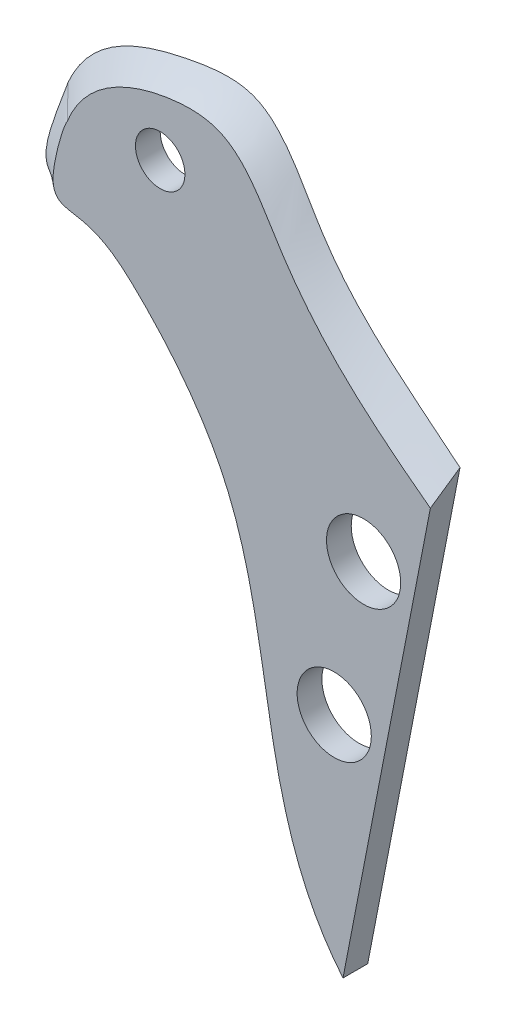
ISO-10303-21;
HEADER;
FILE_DESCRIPTION(('STEP AP214'),'2;1');
FILE_NAME('part.step','',(''),(''),'','','');
FILE_SCHEMA(('AUTOMOTIVE_DESIGN { 1 0 10303 214 1 1 1 1 }'));
ENDSEC;
DATA;
#1=APPLICATION_CONTEXT('core data for automotive mechanical design processes');
#2=APPLICATION_PROTOCOL_DEFINITION('international standard','automotive_design',2000,#1);
#3=PRODUCT_CONTEXT('',#1,'mechanical');
#4=PRODUCT('Part','Part','',(#3));
#5=PRODUCT_RELATED_PRODUCT_CATEGORY('part','',(#4));
#6=PRODUCT_DEFINITION_FORMATION('','',#4);
#7=PRODUCT_DEFINITION_CONTEXT('part definition',#1,'design');
#8=PRODUCT_DEFINITION('design','',#6,#7);
#9=PRODUCT_DEFINITION_SHAPE('','',#8);
#10=(LENGTH_UNIT() NAMED_UNIT(*) SI_UNIT(.MILLI.,.METRE.));
#11=(NAMED_UNIT(*) PLANE_ANGLE_UNIT() SI_UNIT($,.RADIAN.));
#12=(NAMED_UNIT(*) SI_UNIT($,.STERADIAN.) SOLID_ANGLE_UNIT());
#13=UNCERTAINTY_MEASURE_WITH_UNIT(LENGTH_MEASURE(1.E-05),#10,'distance_accuracy_value','');
#14=(GEOMETRIC_REPRESENTATION_CONTEXT(3) GLOBAL_UNCERTAINTY_ASSIGNED_CONTEXT((#13)) GLOBAL_UNIT_ASSIGNED_CONTEXT((#10,
#11,#12)) REPRESENTATION_CONTEXT('',''));
#15=CARTESIAN_POINT('',(0.,0.,0.));
#16=DIRECTION('',(0.,0.,1.));
#17=DIRECTION('',(1.,0.,0.));
#18=AXIS2_PLACEMENT_3D('',#15,#16,#17);
#19=CARTESIAN_POINT('',(0.,0.,30.013289283743));
#20=DIRECTION('',(0.,0.,-1.));
#21=DIRECTION('',(-1.,0.,0.));
#22=AXIS2_PLACEMENT_3D('',#19,#20,#21);
#23=PLANE('',#22);
#24=CARTESIAN_POINT('',(40.2778882950094,12.0174412329978,30.013289283743));
#25=DIRECTION('',(0.,0.,-1.));
#26=DIRECTION('',(-1.,0.,0.));
#27=AXIS2_PLACEMENT_3D('',#24,#25,#26);
#28=CIRCLE('',#27,1.7);
#29=CARTESIAN_POINT('',(38.5778882950094,12.0174412329978,30.013289283743));
#30=VERTEX_POINT('',#29);
#31=EDGE_CURVE('E162',#30,#30,#28,.F.);
#32=ORIENTED_EDGE('',*,*,#31,.T.);
#33=EDGE_LOOP('',(#32));
#34=FACE_BOUND('',#33,.T.);
#35=CARTESIAN_POINT('',(52.2416782887102,-15.017432758745,30.013289283743));
#36=DIRECTION('',(0.,0.,-1.));
#37=DIRECTION('',(-1.,0.,0.));
#38=AXIS2_PLACEMENT_3D('',#35,#36,#37);
#39=CIRCLE('',#38,2.54999999999999);
#40=CARTESIAN_POINT('',(49.6916782887102,-15.017432758745,30.013289283743));
#41=VERTEX_POINT('',#40);
#42=EDGE_CURVE('E171',#41,#41,#39,.F.);
#43=ORIENTED_EDGE('',*,*,#42,.T.);
#44=EDGE_LOOP('',(#43));
#45=FACE_BOUND('',#44,.T.);
#46=CARTESIAN_POINT('',(59.1866082842384,2.31655029087227,30.013289283743));
#47=CARTESIAN_POINT('',(55.5333547569396,5.37200350174671,30.013289283743));
#48=CARTESIAN_POINT('',(50.3563460795847,8.97370204998886,30.013289283743));
#49=CARTESIAN_POINT('',(46.4228075177713,18.1170294651366,30.013289283743));
#50=CARTESIAN_POINT('',(38.3922126218077,17.1644202277484,30.013289283743));
#51=CARTESIAN_POINT('',(33.8009564372788,15.3919532379688,30.013289283743));
#52=CARTESIAN_POINT('',(32.2359920814305,11.7483802516687,30.013289283743));
#53=B_SPLINE_CURVE_WITH_KNOTS('',3,(#46,#47,#48,#49,#50,#51,#52),.UNSPECIFIED.,.F.,.F.,(4,1,1,1,
4),(0.,0.379573755906784,0.583156846162769,0.702934632684244,1.),.UNSPECIFIED.);
#54=CARTESIAN_POINT('',(59.1866082842384,2.31655029087227,30.013289283743));
#55=VERTEX_POINT('',#54);
#56=CARTESIAN_POINT('',(32.2359920814305,11.7483802516687,30.013289283743));
#57=VERTEX_POINT('',#56);
#58=EDGE_CURVE('E53',#55,#57,#53,.T.);
#59=ORIENTED_EDGE('',*,*,#58,.F.);
#60=DIRECTION('',(-0.190360349727866,-0.98171428493808,0.));
#61=VECTOR('',#60,1.);
#62=CARTESIAN_POINT('',(57.4834926467632,-6.46664932291833,30.013289283743));
#63=LINE('',#62,#61);
#64=CARTESIAN_POINT('',(52.8448032906845,-30.3890029578152,30.013289283743));
#65=VERTEX_POINT('',#64);
#66=EDGE_CURVE('E87',#55,#65,#63,.T.);
#67=ORIENTED_EDGE('',*,*,#66,.T.);
#68=CARTESIAN_POINT('',(32.2359920814305,11.7483802516687,30.013289283743));
#69=CARTESIAN_POINT('',(32.0391638031607,11.1977834179729,30.013289283743));
#70=CARTESIAN_POINT('',(31.1172750102454,8.89558190594387,30.013289283743));
#71=CARTESIAN_POINT('',(30.1766496252198,5.20290054989083,30.013289283743));
#72=CARTESIAN_POINT('',(35.0316263190903,4.78377688389193,30.013289283743));
#73=CARTESIAN_POINT('',(39.758918338248,1.56715151651564,30.013289283743));
#74=CARTESIAN_POINT('',(47.9191438448916,-10.1862882712879,30.013289283743));
#75=CARTESIAN_POINT('',(46.7945352629169,-23.0216187639972,30.013289283743));
#76=CARTESIAN_POINT('',(52.8448032906845,-30.3890029578152,30.013289283743));
#77=B_SPLINE_CURVE_WITH_KNOTS('',3,(#68,#69,#70,#71,#72,#73,#74,#75,#76),.UNSPECIFIED.,.F.,.F.,
(4,1,1,1,1,1,4),(0.,0.0634739836974081,0.118425301735854,0.193565341111615,0.283413176700978,
0.473561281053638,1.),.UNSPECIFIED.);
#78=EDGE_CURVE('E11',#57,#65,#77,.T.);
#79=ORIENTED_EDGE('',*,*,#78,.F.);
#80=EDGE_LOOP('',(#59,#67,#79));
#81=FACE_BOUND('',#80,.T.);
#82=CARTESIAN_POINT('',(54.2604282887102,-4.8890029578152,30.013289283743));
#83=DIRECTION('',(0.,0.,-1.));
#84=DIRECTION('',(-1.,0.,0.));
#85=AXIS2_PLACEMENT_3D('',#82,#83,#84);
#86=CIRCLE('',#85,2.55);
#87=CARTESIAN_POINT('',(51.7104282887101,-4.8890029578152,30.013289283743));
#88=VERTEX_POINT('',#87);
#89=EDGE_CURVE('E165',#88,#88,#86,.F.);
#90=ORIENTED_EDGE('',*,*,#89,.T.);
#91=EDGE_LOOP('',(#90));
#92=FACE_BOUND('',#91,.T.);
#93=ADVANCED_FACE('F41',(#34,#45,#81,#92),#23,.T.);
#94=CARTESIAN_POINT('',(57.4834926467632,-6.46664932291833,17.730789283743));
#95=DIRECTION('',(-0.981714284938079,0.190360349727866,0.));
#96=DIRECTION('',(-0.190360349727866,-0.98171428493808,0.));
#97=AXIS2_PLACEMENT_3D('',#94,#95,#96);
#98=PLANE('',#97);
#99=ORIENTED_EDGE('',*,*,#66,.F.);
#100=DIRECTION('',(0.137169592660813,0.707402296574711,-0.693373271514046));
#101=VECTOR('',#100,1.);
#102=CARTESIAN_POINT('',(59.0184533256443,1.44935223638781,30.863289283743));
#103=LINE('',#102,#101);
#104=CARTESIAN_POINT('',(58.8502983670502,0.582154181903358,31.713289283743));
#105=VERTEX_POINT('',#104);
#106=EDGE_CURVE('E80',#105,#55,#103,.T.);
#107=ORIENTED_EDGE('',*,*,#106,.F.);
#108=DIRECTION('',(0.190360349727867,0.981714284938079,0.));
#109=VECTOR('',#108,1.);
#110=CARTESIAN_POINT('',(58.8502983670502,0.582154181903358,31.713289283743));
#111=LINE('',#110,#109);
#112=CARTESIAN_POINT('',(52.8448032906845,-30.3890029578152,31.713289283743));
#113=VERTEX_POINT('',#112);
#114=EDGE_CURVE('E85',#113,#105,#111,.T.);
#115=ORIENTED_EDGE('',*,*,#114,.F.);
#116=DIRECTION('',(0.,0.,1.));
#117=VECTOR('',#116,1.);
#118=CARTESIAN_POINT('',(52.8448032906845,-30.3890029578152,30.863289283743));
#119=LINE('',#118,#117);
#120=EDGE_CURVE('E229',#65,#113,#119,.T.);
#121=ORIENTED_EDGE('',*,*,#120,.F.);
#122=EDGE_LOOP('',(#99,#107,#115,#121));
#123=FACE_BOUND('',#122,.T.);
#124=ADVANCED_FACE('F82',(#123),#98,.F.);
#125=CARTESIAN_POINT('',(45.6690504757318,-7.32977099782672,31.713289283743));
#126=DIRECTION('',(0.,0.,-1.));
#127=DIRECTION('',(-1.,0.,0.));
#128=AXIS2_PLACEMENT_3D('',#125,#126,#127);
#129=PLANE('',#128);
#130=CARTESIAN_POINT('',(52.2416782887102,-15.017432758745,31.713289283743));
#131=DIRECTION('',(0.,0.,1.));
#132=DIRECTION('',(1.,0.,0.));
#133=AXIS2_PLACEMENT_3D('',#130,#131,#132);
#134=CIRCLE('',#133,2.54999999999999);
#135=CARTESIAN_POINT('',(54.7916782887101,-15.017432758745,31.713289283743));
#136=VERTEX_POINT('',#135);
#137=EDGE_CURVE('E145',#136,#136,#134,.T.);
#138=ORIENTED_EDGE('',*,*,#137,.F.);
#139=EDGE_LOOP('',(#138));
#140=FACE_BOUND('',#139,.T.);
#141=CARTESIAN_POINT('',(54.2604282887102,-4.8890029578152,31.713289283743));
#142=DIRECTION('',(0.,0.,1.));
#143=DIRECTION('',(1.,0.,0.));
#144=AXIS2_PLACEMENT_3D('',#141,#142,#143);
#145=CIRCLE('',#144,2.55);
#146=CARTESIAN_POINT('',(56.8104282887102,-4.8890029578152,31.713289283743));
#147=VERTEX_POINT('',#146);
#148=EDGE_CURVE('E267',#147,#147,#145,.T.);
#149=ORIENTED_EDGE('',*,*,#148,.F.);
#150=EDGE_LOOP('',(#149));
#151=FACE_BOUND('',#150,.T.);
#152=CARTESIAN_POINT('',(40.2778882950094,12.0174412329978,31.713289283743));
#153=DIRECTION('',(0.,0.,-1.));
#154=DIRECTION('',(-1.,0.,0.));
#155=AXIS2_PLACEMENT_3D('',#152,#153,#154);
#156=CIRCLE('',#155,1.7);
#157=CARTESIAN_POINT('',(38.5778882950094,12.0174412329978,31.713289283743));
#158=VERTEX_POINT('',#157);
#159=EDGE_CURVE('E90',#158,#158,#156,.T.);
#160=ORIENTED_EDGE('',*,*,#159,.T.);
#161=EDGE_LOOP('',(#160));
#162=FACE_BOUND('',#161,.T.);
#163=CARTESIAN_POINT('',(33.9072419780726,11.1608982302468,31.713289283743));
#164=CARTESIAN_POINT('',(33.6960790230969,10.8900327996302,31.713289283743));
#165=CARTESIAN_POINT('',(32.9632999997767,8.60805804038253,31.713289283743));
#166=CARTESIAN_POINT('',(32.7656863797307,5.95017231439694,31.713289283743));
#167=CARTESIAN_POINT('',(36.0475396281196,5.77660384822842,31.713289283743));
#168=CARTESIAN_POINT('',(40.1509390488213,2.23022416718721,31.713289283743));
#169=CARTESIAN_POINT('',(49.0161937001583,-8.99625873655049,31.713289283743));
#170=CARTESIAN_POINT('',(46.7768600490162,-23.0929190605882,31.713289283743));
#171=CARTESIAN_POINT('',(52.8448032906845,-30.3890029578152,31.713289283743));
#172=B_SPLINE_CURVE_WITH_KNOTS('',3,(#163,#164,#165,#166,#167,#168,#169,#170,#171),
.UNSPECIFIED.,.F.,.F.,(4,1,1,1,1,1,4),(0.,0.0618691743171781,0.104877433914272,
0.140990087097665,0.232652655485206,0.44215472429863,1.),.UNSPECIFIED.);
#173=CARTESIAN_POINT('',(33.9072419780726,11.1608982302468,31.713289283743));
#174=VERTEX_POINT('',#173);
#175=EDGE_CURVE('E106',#174,#113,#172,.T.);
#176=ORIENTED_EDGE('',*,*,#175,.T.);
#177=ORIENTED_EDGE('',*,*,#114,.T.);
#178=CARTESIAN_POINT('',(58.8502983670502,0.582154181903358,31.713289283743));
#179=CARTESIAN_POINT('',(54.6375536116588,3.72911890341942,31.713289283743));
#180=CARTESIAN_POINT('',(49.7861220121252,7.82016955184531,31.713289283743));
#181=CARTESIAN_POINT('',(45.5580551972648,16.2243115229969,31.713289283743));
#182=CARTESIAN_POINT('',(38.8669179019402,16.1253118462174,31.713289283743));
#183=CARTESIAN_POINT('',(35.0563370192907,14.0514408900861,31.713289283743));
#184=CARTESIAN_POINT('',(33.9072419780726,11.1608982302468,31.713289283743));
#185=B_SPLINE_CURVE_WITH_KNOTS('',3,(#178,#179,#180,#181,#182,#183,#184),.UNSPECIFIED.,.F.,.F.,
(4,1,1,1,4),(0.,0.443669854560584,0.631844867473527,0.739701273066536,1.),.UNSPECIFIED.);
#186=EDGE_CURVE('E94',#105,#174,#185,.T.);
#187=ORIENTED_EDGE('',*,*,#186,.T.);
#188=EDGE_LOOP('',(#176,#177,#187));
#189=FACE_BOUND('',#188,.T.);
#190=ADVANCED_FACE('F105',(#140,#151,#162,#189),#129,.F.);
#191=CARTESIAN_POINT('',(32.2359920814305,11.7483802516687,30.013289283743));
#192=CARTESIAN_POINT('',(33.9072419780726,11.1608982302468,31.713289283743));
#193=CARTESIAN_POINT('',(32.0441402021333,11.2117041286637,30.013289283743));
#194=CARTESIAN_POINT('',(33.6960790230969,10.8900327996302,31.713289283743));
#195=CARTESIAN_POINT('',(31.5575395421801,9.99503953999069,30.013289283743));
#196=CARTESIAN_POINT('',(33.252586061417,9.5089346619242,31.713289283743));
#197=CARTESIAN_POINT('',(30.901384361174,7.97609570288549,30.013289283743));
#198=CARTESIAN_POINT('',(32.8743340025538,7.41147323989284,31.713289283743));
#199=CARTESIAN_POINT('',(30.6076260406025,6.89481594928121,30.013289283743));
#200=CARTESIAN_POINT('',(32.8187157287241,6.36576028868581,31.713289283743));
#201=CARTESIAN_POINT('',(30.8954084548017,5.83965979232856,30.013289283743));
#202=CARTESIAN_POINT('',(33.8524947128075,5.89269391999161,31.713289283743));
#203=CARTESIAN_POINT('',(31.8877538184674,5.05518320589504,30.013289283743));
#204=CARTESIAN_POINT('',(35.4904654784108,5.71324151605375,31.713289283743));
#205=CARTESIAN_POINT('',(34.2723296968009,4.7257787669229,30.013289283743));
#206=CARTESIAN_POINT('',(37.126538770345,4.84407443991782,31.713289283743));
#207=CARTESIAN_POINT('',(36.5521313909395,3.74916866305139,30.013289283743));
#208=CARTESIAN_POINT('',(38.8133976572541,3.28302426988339,31.713289283743));
#209=CARTESIAN_POINT('',(39.7503754207592,1.30612283839873,30.013289283743));
#210=CARTESIAN_POINT('',(41.6207904889491,0.368883155269356,31.713289283743));
#211=CARTESIAN_POINT('',(42.2743675479331,-2.05593228199478,30.013289283743));
#212=CARTESIAN_POINT('',(43.8960701658193,-2.86406152662291,31.713289283743));
#213=CARTESIAN_POINT('',(47.6700154756001,-13.0296286176255,30.013289283743));
#214=CARTESIAN_POINT('',(48.3131551141228,-13.4219038997801,31.713289283743));
#215=CARTESIAN_POINT('',(46.7945352629169,-23.0216187639972,30.013289283743));
#216=CARTESIAN_POINT('',(47.1184838147925,-23.5036868540762,31.713289283743));
#217=CARTESIAN_POINT('',(52.8448032906845,-30.3890029578152,30.013289283743));
#218=CARTESIAN_POINT('',(52.8448032906845,-30.3890029578152,31.713289283743));
#219=B_SPLINE_SURFACE_WITH_KNOTS('',3,1,((#191,#192),(#193,#194),(#195,#196),(#197,#198),(#199,
#200),(#201,#202),(#203,#204),(#205,#206),(#207,#208),(#209,#210),(#211,#212),(#213,#214),(#215,
#216),(#217,#218)),.UNSPECIFIED.,.F.,.F.,.F.,(4,1,1,1,1,1,1,1,1,1,1,4),(2,2),(0.,
0.0618691743171781,0.0634739836974081,0.104877433914272,0.118425301735854,0.140990087097665,
0.193565341111615,0.232652655485206,0.283413176700978,0.44215472429863,0.473561281053638,1.),
(0.,1.),.UNSPECIFIED.);
#220=DIRECTION('',(0.680686533146075,-0.239276664280315,0.692396217150602));
#221=VECTOR('',#220,1.);
#222=CARTESIAN_POINT('',(33.0716170297516,11.4546392409578,30.863289283743));
#223=LINE('',#222,#221);
#224=EDGE_CURVE('E91',#57,#174,#223,.T.);
#225=ORIENTED_EDGE('',*,*,#78,.T.);
#226=ORIENTED_EDGE('',*,*,#120,.T.);
#227=ORIENTED_EDGE('',*,*,#175,.F.);
#228=ORIENTED_EDGE('',*,*,#224,.F.);
#229=EDGE_LOOP('',(#225,#226,#227,#228));
#230=FACE_BOUND('',#229,.T.);
#231=ADVANCED_FACE('F126',(#230),#219,.T.);
#232=CARTESIAN_POINT('',(59.1866082842384,2.31655029087227,30.013289283743));
#233=CARTESIAN_POINT('',(58.8502983670502,0.582154181903358,31.713289283743));
#234=CARTESIAN_POINT('',(55.5333547569396,5.37200350174671,30.013289283743));
#235=CARTESIAN_POINT('',(55.2461604409695,3.2744831890996,31.713289283743));
#236=CARTESIAN_POINT('',(51.5946499264045,8.11220124028726,30.013289283743));
#237=CARTESIAN_POINT('',(51.7231101959465,6.18677194480138,31.713289283743));
#238=CARTESIAN_POINT('',(47.8736223660526,14.744677836155,30.013289283743));
#239=CARTESIAN_POINT('',(47.9329539294505,11.6745344007484,31.713289283743));
#240=CARTESIAN_POINT('',(46.0945183802308,17.2988517696202,30.013289283743));
#241=CARTESIAN_POINT('',(46.4528492452718,14.4457265233554,31.713289283743));
#242=CARTESIAN_POINT('',(43.1574925504654,17.729689642728,30.013289283743));
#243=CARTESIAN_POINT('',(44.1998997690521,15.9816749883543,31.713289283743));
#244=CARTESIAN_POINT('',(41.1665096117991,17.4396555021939,30.013289283743));
#245=CARTESIAN_POINT('',(42.4398056461874,16.1781750167425,31.713289283743));
#246=CARTESIAN_POINT('',(36.6679775910553,16.498774584857,30.013289283743));
#247=CARTESIAN_POINT('',(38.1311049895818,15.7248529463592,31.713289283743));
#248=CARTESIAN_POINT('',(33.6072668052544,14.9410021934079,30.013289283743));
#249=CARTESIAN_POINT('',(35.0563370192907,14.0514408900861,31.713289283743));
#250=CARTESIAN_POINT('',(32.2359920814305,11.7483802516687,30.013289283743));
#251=CARTESIAN_POINT('',(33.9072419780726,11.1608982302468,31.713289283743));
#252=B_SPLINE_SURFACE_WITH_KNOTS('',3,1,((#232,#233),(#234,#235),(#236,#237),(#238,#239),(#240,
#241),(#242,#243),(#244,#245),(#246,#247),(#248,#249),(#250,#251)),.UNSPECIFIED.,.F.,.F.,.F.,(4,
1,1,1,1,1,1,4),(2,2),(0.,0.379573755906784,0.443669854560584,0.583156846162769,
0.631844867473527,0.702934632684244,0.739701273066536,1.),(0.,1.),.UNSPECIFIED.);
#253=ORIENTED_EDGE('',*,*,#58,.T.);
#254=ORIENTED_EDGE('',*,*,#224,.T.);
#255=ORIENTED_EDGE('',*,*,#186,.F.);
#256=ORIENTED_EDGE('',*,*,#106,.T.);
#257=EDGE_LOOP('',(#253,#254,#255,#256));
#258=FACE_BOUND('',#257,.T.);
#259=ADVANCED_FACE('F96',(#258),#252,.T.);
#260=CARTESIAN_POINT('',(52.2416782887102,-15.017432758745,12.6008001156402));
#261=DIRECTION('',(0.,0.,1.));
#262=DIRECTION('',(1.,0.,0.));
#263=AXIS2_PLACEMENT_3D('',#260,#261,#262);
#264=CYLINDRICAL_SURFACE('',#263,2.54999999999999);
#265=ORIENTED_EDGE('',*,*,#137,.T.);
#266=EDGE_LOOP('',(#265));
#267=FACE_BOUND('',#266,.T.);
#268=ORIENTED_EDGE('',*,*,#42,.F.);
#269=EDGE_LOOP('',(#268));
#270=FACE_BOUND('',#269,.T.);
#271=ADVANCED_FACE('F43',(#267,#270),#264,.F.);
#272=CARTESIAN_POINT('',(54.2604282887102,-4.8890029578152,12.6008001156402));
#273=DIRECTION('',(0.,0.,1.));
#274=DIRECTION('',(1.,0.,0.));
#275=AXIS2_PLACEMENT_3D('',#272,#273,#274);
#276=CYLINDRICAL_SURFACE('',#275,2.55);
#277=ORIENTED_EDGE('',*,*,#148,.T.);
#278=EDGE_LOOP('',(#277));
#279=FACE_BOUND('',#278,.T.);
#280=ORIENTED_EDGE('',*,*,#89,.F.);
#281=EDGE_LOOP('',(#280));
#282=FACE_BOUND('',#281,.T.);
#283=ADVANCED_FACE('F181',(#279,#282),#276,.F.);
#284=CARTESIAN_POINT('',(40.2778882950094,12.0174412329978,32.138289283743));
#285=DIRECTION('',(0.,0.,-1.));
#286=DIRECTION('',(-1.,0.,0.));
#287=AXIS2_PLACEMENT_3D('',#284,#285,#286);
#288=CYLINDRICAL_SURFACE('',#287,1.7);
#289=ORIENTED_EDGE('',*,*,#159,.F.);
#290=EDGE_LOOP('',(#289));
#291=FACE_BOUND('',#290,.T.);
#292=ORIENTED_EDGE('',*,*,#31,.F.);
#293=EDGE_LOOP('',(#292));
#294=FACE_BOUND('',#293,.T.);
#295=ADVANCED_FACE('F187',(#291,#294),#288,.F.);
#296=CLOSED_SHELL('',(#93,#124,#190,#231,#259,#271,#283,#295));
#297=MANIFOLD_SOLID_BREP('B2',#296);
#298=ADVANCED_BREP_SHAPE_REPRESENTATION('',(#18,#297),#14);
#299=SHAPE_DEFINITION_REPRESENTATION(#9,#298);
ENDSEC;
END-ISO-10303-21;
